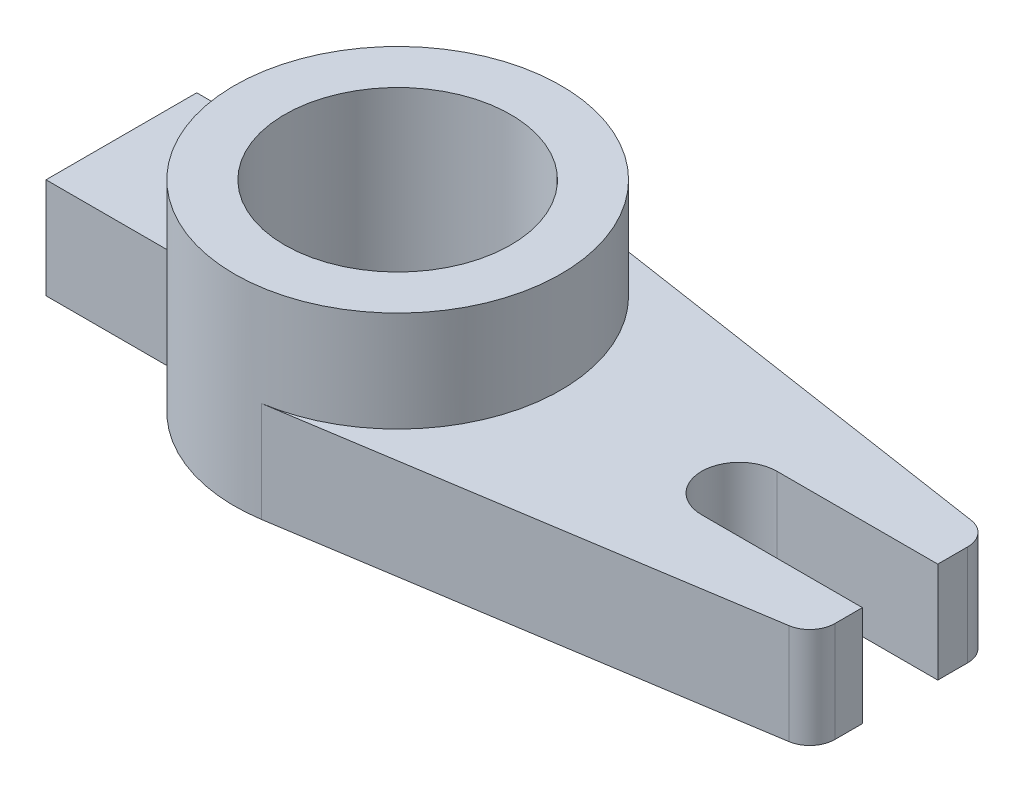
ISO-10303-21;
HEADER;
FILE_DESCRIPTION(('STEP AP214'),'2;1');
FILE_NAME('part.step','',(''),(''),'','','');
FILE_SCHEMA(('AUTOMOTIVE_DESIGN { 1 0 10303 214 1 1 1 1 }'));
ENDSEC;
DATA;
#1=APPLICATION_CONTEXT('core data for automotive mechanical design processes');
#2=APPLICATION_PROTOCOL_DEFINITION('international standard','automotive_design',2000,#1);
#3=PRODUCT_CONTEXT('',#1,'mechanical');
#4=PRODUCT('Part','Part','',(#3));
#5=PRODUCT_RELATED_PRODUCT_CATEGORY('part','',(#4));
#6=PRODUCT_DEFINITION_FORMATION('','',#4);
#7=PRODUCT_DEFINITION_CONTEXT('part definition',#1,'design');
#8=PRODUCT_DEFINITION('design','',#6,#7);
#9=PRODUCT_DEFINITION_SHAPE('','',#8);
#10=(LENGTH_UNIT() NAMED_UNIT(*) SI_UNIT(.MILLI.,.METRE.));
#11=(NAMED_UNIT(*) PLANE_ANGLE_UNIT() SI_UNIT($,.RADIAN.));
#12=(NAMED_UNIT(*) SI_UNIT($,.STERADIAN.) SOLID_ANGLE_UNIT());
#13=UNCERTAINTY_MEASURE_WITH_UNIT(LENGTH_MEASURE(1.E-05),#10,'distance_accuracy_value','');
#14=(GEOMETRIC_REPRESENTATION_CONTEXT(3) GLOBAL_UNCERTAINTY_ASSIGNED_CONTEXT((#13)) GLOBAL_UNIT_ASSIGNED_CONTEXT((#10,
#11,#12)) REPRESENTATION_CONTEXT('',''));
#15=CARTESIAN_POINT('',(0.,0.,0.));
#16=DIRECTION('',(0.,0.,1.));
#17=DIRECTION('',(1.,0.,0.));
#18=AXIS2_PLACEMENT_3D('',#15,#16,#17);
#19=CARTESIAN_POINT('',(0.,40.,0.));
#20=DIRECTION('',(0.,-1.,0.));
#21=DIRECTION('',(0.,0.,-1.));
#22=AXIS2_PLACEMENT_3D('',#19,#20,#21);
#23=CYLINDRICAL_SURFACE('',#22,32.5);
#24=CARTESIAN_POINT('',(0.,40.,0.));
#25=DIRECTION('',(0.,1.,0.));
#26=DIRECTION('',(0.,0.,1.));
#27=AXIS2_PLACEMENT_3D('',#24,#25,#26);
#28=CIRCLE('',#27,32.5);
#29=CARTESIAN_POINT('',(0.,40.,32.5));
#30=VERTEX_POINT('',#29);
#31=EDGE_CURVE('E197',#30,#30,#28,.T.);
#32=ORIENTED_EDGE('',*,*,#31,.F.);
#33=EDGE_LOOP('',(#32));
#34=FACE_BOUND('',#33,.T.);
#35=DIRECTION('',(0.,-1.,0.));
#36=VECTOR('',#35,1.);
#37=CARTESIAN_POINT('',(-28.831406486677,20.,-15.));
#38=LINE('',#37,#36);
#39=CARTESIAN_POINT('',(-28.831406486677,20.,-15.));
#40=VERTEX_POINT('',#39);
#41=CARTESIAN_POINT('',(-28.831406486677,0.,-15.));
#42=VERTEX_POINT('',#41);
#43=EDGE_CURVE('E64',#40,#42,#38,.T.);
#44=ORIENTED_EDGE('',*,*,#43,.F.);
#45=CARTESIAN_POINT('',(7.8756445809347E-13,20.,0.));
#46=DIRECTION('',(0.,-1.,0.));
#47=DIRECTION('',(0.,0.,1.));
#48=AXIS2_PLACEMENT_3D('',#45,#46,#47);
#49=CIRCLE('',#48,32.5000000000007);
#50=CARTESIAN_POINT('',(-28.831406486677,20.,15.));
#51=VERTEX_POINT('',#50);
#52=EDGE_CURVE('E59',#51,#40,#49,.T.);
#53=ORIENTED_EDGE('',*,*,#52,.F.);
#54=DIRECTION('',(0.,-1.,0.));
#55=VECTOR('',#54,1.);
#56=CARTESIAN_POINT('',(-28.831406486677,20.,15.));
#57=LINE('',#56,#55);
#58=CARTESIAN_POINT('',(-28.831406486677,0.,15.));
#59=VERTEX_POINT('',#58);
#60=EDGE_CURVE('E169',#51,#59,#57,.T.);
#61=ORIENTED_EDGE('',*,*,#60,.T.);
#62=CARTESIAN_POINT('',(0.,0.,0.));
#63=DIRECTION('',(0.,1.,0.));
#64=DIRECTION('',(0.,0.,1.));
#65=AXIS2_PLACEMENT_3D('',#62,#63,#64);
#66=CIRCLE('',#65,32.5);
#67=CARTESIAN_POINT('',(5.02174069701689,0.,32.1096888862524));
#68=VERTEX_POINT('',#67);
#69=EDGE_CURVE('E193',#59,#68,#66,.T.);
#70=ORIENTED_EDGE('',*,*,#69,.T.);
#71=DIRECTION('',(0.,-1.,0.));
#72=VECTOR('',#71,1.);
#73=CARTESIAN_POINT('',(5.02174069701689,20.,32.1096888862525));
#74=LINE('',#73,#72);
#75=CARTESIAN_POINT('',(5.02174069701689,20.,32.1096888862525));
#76=VERTEX_POINT('',#75);
#77=EDGE_CURVE('E11',#76,#68,#74,.T.);
#78=ORIENTED_EDGE('',*,*,#77,.F.);
#79=CARTESIAN_POINT('',(0.,20.,0.));
#80=DIRECTION('',(0.,-1.,0.));
#81=DIRECTION('',(0.,0.,-1.));
#82=AXIS2_PLACEMENT_3D('',#79,#80,#81);
#83=CIRCLE('',#82,32.5);
#84=CARTESIAN_POINT('',(4.86046625450318,20.,-32.1344965385929));
#85=VERTEX_POINT('',#84);
#86=EDGE_CURVE('E205',#85,#76,#83,.T.);
#87=ORIENTED_EDGE('',*,*,#86,.F.);
#88=DIRECTION('',(0.,-1.,0.));
#89=VECTOR('',#88,1.);
#90=CARTESIAN_POINT('',(4.86046625450318,20.,-32.1344965385929));
#91=LINE('',#90,#89);
#92=CARTESIAN_POINT('',(4.86046625450318,0.,-32.1344965385929));
#93=VERTEX_POINT('',#92);
#94=EDGE_CURVE('E237',#85,#93,#91,.T.);
#95=ORIENTED_EDGE('',*,*,#94,.T.);
#96=EDGE_CURVE('E202',#93,#42,#66,.T.);
#97=ORIENTED_EDGE('',*,*,#96,.T.);
#98=EDGE_LOOP('',(#44,#53,#61,#70,#78,#87,#95,#97));
#99=FACE_BOUND('',#98,.T.);
#100=ADVANCED_FACE('F43',(#34,#99),#23,.T.);
#101=CARTESIAN_POINT('',(95.7725754918488,20.,17.9168649697123));
#102=DIRECTION('',(-0.154515098369752,0.,-0.987990427269306));
#103=DIRECTION('',(-0.987990427269306,0.,0.154515098369752));
#104=AXIS2_PLACEMENT_3D('',#101,#102,#103);
#105=PLANE('',#104);
#106=DIRECTION('',(0.987990427269306,0.,-0.154515098369752));
#107=VECTOR('',#106,1.);
#108=CARTESIAN_POINT('',(95.7725754918488,0.,17.9168649697123));
#109=LINE('',#108,#107);
#110=CARTESIAN_POINT('',(95.7725754918488,0.,17.9168649697123));
#111=VERTEX_POINT('',#110);
#112=EDGE_CURVE('E201',#68,#111,#109,.T.);
#113=ORIENTED_EDGE('',*,*,#112,.T.);
#114=DIRECTION('',(0.,-1.,0.));
#115=VECTOR('',#114,1.);
#116=CARTESIAN_POINT('',(95.7725754918488,20.,17.9168649697123));
#117=LINE('',#116,#115);
#118=CARTESIAN_POINT('',(95.7725754918488,20.,17.9168649697123));
#119=VERTEX_POINT('',#118);
#120=EDGE_CURVE('E52',#119,#111,#117,.T.);
#121=ORIENTED_EDGE('',*,*,#120,.F.);
#122=DIRECTION('',(0.987990427269306,0.,-0.154515098369752));
#123=VECTOR('',#122,1.);
#124=CARTESIAN_POINT('',(95.7725754918488,20.,17.9168649697123));
#125=LINE('',#124,#123);
#126=EDGE_CURVE('E209',#76,#119,#125,.T.);
#127=ORIENTED_EDGE('',*,*,#126,.F.);
#128=ORIENTED_EDGE('',*,*,#77,.T.);
#129=EDGE_LOOP('',(#113,#121,#127,#128));
#130=FACE_BOUND('',#129,.T.);
#131=ADVANCED_FACE('F45',(#130),#105,.F.);
#132=CARTESIAN_POINT('',(95.,20.,12.9769128333658));
#133=DIRECTION('',(0.,-1.,0.));
#134=DIRECTION('',(0.,0.,-1.));
#135=AXIS2_PLACEMENT_3D('',#132,#133,#134);
#136=CYLINDRICAL_SURFACE('',#135,5.);
#137=CARTESIAN_POINT('',(95.,0.,12.9769128333658));
#138=DIRECTION('',(0.,1.,0.));
#139=DIRECTION('',(0.,0.,-1.));
#140=AXIS2_PLACEMENT_3D('',#137,#138,#139);
#141=CIRCLE('',#140,5.);
#142=CARTESIAN_POINT('',(100.,0.,12.9769128333658));
#143=VERTEX_POINT('',#142);
#144=EDGE_CURVE('E240',#111,#143,#141,.T.);
#145=ORIENTED_EDGE('',*,*,#144,.T.);
#146=DIRECTION('',(0.,-1.,0.));
#147=VECTOR('',#146,1.);
#148=CARTESIAN_POINT('',(100.,20.,12.9769128333658));
#149=LINE('',#148,#147);
#150=CARTESIAN_POINT('',(100.,20.,12.9769128333658));
#151=VERTEX_POINT('',#150);
#152=EDGE_CURVE('E290',#151,#143,#149,.T.);
#153=ORIENTED_EDGE('',*,*,#152,.F.);
#154=CARTESIAN_POINT('',(95.,20.,12.9769128333658));
#155=DIRECTION('',(0.,1.,0.));
#156=DIRECTION('',(0.,0.,-1.));
#157=AXIS2_PLACEMENT_3D('',#154,#155,#156);
#158=CIRCLE('',#157,5.);
#159=EDGE_CURVE('E213',#119,#151,#158,.T.);
#160=ORIENTED_EDGE('',*,*,#159,.F.);
#161=ORIENTED_EDGE('',*,*,#120,.T.);
#162=EDGE_LOOP('',(#145,#153,#160,#161));
#163=FACE_BOUND('',#162,.T.);
#164=ADVANCED_FACE('F299',(#163),#136,.T.);
#165=CARTESIAN_POINT('',(100.,20.,7.5));
#166=DIRECTION('',(-1.,0.,0.));
#167=DIRECTION('',(0.,0.,1.));
#168=AXIS2_PLACEMENT_3D('',#165,#166,#167);
#169=PLANE('',#168);
#170=DIRECTION('',(0.,0.,-1.));
#171=VECTOR('',#170,1.);
#172=CARTESIAN_POINT('',(100.,0.,7.5));
#173=LINE('',#172,#171);
#174=CARTESIAN_POINT('',(100.,0.,7.5));
#175=VERTEX_POINT('',#174);
#176=EDGE_CURVE('E243',#143,#175,#173,.T.);
#177=ORIENTED_EDGE('',*,*,#176,.T.);
#178=DIRECTION('',(0.,-1.,0.));
#179=VECTOR('',#178,1.);
#180=CARTESIAN_POINT('',(100.,20.,7.5));
#181=LINE('',#180,#179);
#182=CARTESIAN_POINT('',(100.,20.,7.5));
#183=VERTEX_POINT('',#182);
#184=EDGE_CURVE('E286',#183,#175,#181,.T.);
#185=ORIENTED_EDGE('',*,*,#184,.F.);
#186=DIRECTION('',(0.,0.,-1.));
#187=VECTOR('',#186,1.);
#188=CARTESIAN_POINT('',(100.,20.,7.5));
#189=LINE('',#188,#187);
#190=EDGE_CURVE('E216',#151,#183,#189,.T.);
#191=ORIENTED_EDGE('',*,*,#190,.F.);
#192=ORIENTED_EDGE('',*,*,#152,.T.);
#193=EDGE_LOOP('',(#177,#185,#191,#192));
#194=FACE_BOUND('',#193,.T.);
#195=ADVANCED_FACE('F311',(#194),#169,.F.);
#196=CARTESIAN_POINT('',(68.,20.,7.5));
#197=DIRECTION('',(0.,0.,1.));
#198=DIRECTION('',(1.,0.,0.));
#199=AXIS2_PLACEMENT_3D('',#196,#197,#198);
#200=PLANE('',#199);
#201=DIRECTION('',(-1.,0.,0.));
#202=VECTOR('',#201,1.);
#203=CARTESIAN_POINT('',(68.,0.,7.5));
#204=LINE('',#203,#202);
#205=CARTESIAN_POINT('',(68.,0.,7.5));
#206=VERTEX_POINT('',#205);
#207=EDGE_CURVE('E246',#175,#206,#204,.T.);
#208=ORIENTED_EDGE('',*,*,#207,.T.);
#209=DIRECTION('',(0.,-1.,0.));
#210=VECTOR('',#209,1.);
#211=CARTESIAN_POINT('',(68.,20.,7.5));
#212=LINE('',#211,#210);
#213=CARTESIAN_POINT('',(68.,20.,7.5));
#214=VERTEX_POINT('',#213);
#215=EDGE_CURVE('E282',#214,#206,#212,.T.);
#216=ORIENTED_EDGE('',*,*,#215,.F.);
#217=DIRECTION('',(-1.,0.,0.));
#218=VECTOR('',#217,1.);
#219=CARTESIAN_POINT('',(68.,20.,7.5));
#220=LINE('',#219,#218);
#221=EDGE_CURVE('E219',#183,#214,#220,.T.);
#222=ORIENTED_EDGE('',*,*,#221,.F.);
#223=ORIENTED_EDGE('',*,*,#184,.T.);
#224=EDGE_LOOP('',(#208,#216,#222,#223));
#225=FACE_BOUND('',#224,.T.);
#226=ADVANCED_FACE('F315',(#225),#200,.F.);
#227=CARTESIAN_POINT('',(68.,20.,0.));
#228=DIRECTION('',(0.,-1.,0.));
#229=DIRECTION('',(0.,0.,-1.));
#230=AXIS2_PLACEMENT_3D('',#227,#228,#229);
#231=CYLINDRICAL_SURFACE('',#230,7.5);
#232=CARTESIAN_POINT('',(68.,0.,0.));
#233=DIRECTION('',(0.,-1.,0.));
#234=DIRECTION('',(0.,0.,1.));
#235=AXIS2_PLACEMENT_3D('',#232,#233,#234);
#236=CIRCLE('',#235,7.5);
#237=CARTESIAN_POINT('',(68.,0.,-7.5));
#238=VERTEX_POINT('',#237);
#239=EDGE_CURVE('E249',#206,#238,#236,.T.);
#240=ORIENTED_EDGE('',*,*,#239,.T.);
#241=DIRECTION('',(0.,-1.,0.));
#242=VECTOR('',#241,1.);
#243=CARTESIAN_POINT('',(68.,20.,-7.5));
#244=LINE('',#243,#242);
#245=CARTESIAN_POINT('',(68.,20.,-7.5));
#246=VERTEX_POINT('',#245);
#247=EDGE_CURVE('E278',#246,#238,#244,.T.);
#248=ORIENTED_EDGE('',*,*,#247,.F.);
#249=CARTESIAN_POINT('',(68.,20.,0.));
#250=DIRECTION('',(0.,-1.,0.));
#251=DIRECTION('',(0.,0.,1.));
#252=AXIS2_PLACEMENT_3D('',#249,#250,#251);
#253=CIRCLE('',#252,7.5);
#254=EDGE_CURVE('E222',#214,#246,#253,.T.);
#255=ORIENTED_EDGE('',*,*,#254,.F.);
#256=ORIENTED_EDGE('',*,*,#215,.T.);
#257=EDGE_LOOP('',(#240,#248,#255,#256));
#258=FACE_BOUND('',#257,.T.);
#259=ADVANCED_FACE('F366',(#258),#231,.F.);
#260=CARTESIAN_POINT('',(68.,20.,-7.5));
#261=DIRECTION('',(0.,0.,-1.));
#262=DIRECTION('',(-1.,0.,0.));
#263=AXIS2_PLACEMENT_3D('',#260,#261,#262);
#264=PLANE('',#263);
#265=DIRECTION('',(1.,0.,0.));
#266=VECTOR('',#265,1.);
#267=CARTESIAN_POINT('',(68.,0.,-7.5));
#268=LINE('',#267,#266);
#269=CARTESIAN_POINT('',(100.,0.,-7.5));
#270=VERTEX_POINT('',#269);
#271=EDGE_CURVE('E252',#238,#270,#268,.T.);
#272=ORIENTED_EDGE('',*,*,#271,.T.);
#273=DIRECTION('',(0.,-1.,0.));
#274=VECTOR('',#273,1.);
#275=CARTESIAN_POINT('',(100.,20.,-7.5));
#276=LINE('',#275,#274);
#277=CARTESIAN_POINT('',(100.,20.,-7.5));
#278=VERTEX_POINT('',#277);
#279=EDGE_CURVE('E274',#278,#270,#276,.T.);
#280=ORIENTED_EDGE('',*,*,#279,.F.);
#281=DIRECTION('',(1.,0.,0.));
#282=VECTOR('',#281,1.);
#283=CARTESIAN_POINT('',(68.,20.,-7.5));
#284=LINE('',#283,#282);
#285=EDGE_CURVE('E225',#246,#278,#284,.T.);
#286=ORIENTED_EDGE('',*,*,#285,.F.);
#287=ORIENTED_EDGE('',*,*,#247,.T.);
#288=EDGE_LOOP('',(#272,#280,#286,#287));
#289=FACE_BOUND('',#288,.T.);
#290=ADVANCED_FACE('F362',(#289),#264,.F.);
#291=CARTESIAN_POINT('',(100.,20.,-13.4436743175163));
#292=DIRECTION('',(-1.,0.,0.));
#293=DIRECTION('',(0.,0.,1.));
#294=AXIS2_PLACEMENT_3D('',#291,#292,#293);
#295=PLANE('',#294);
#296=DIRECTION('',(0.,0.,-1.));
#297=VECTOR('',#296,1.);
#298=CARTESIAN_POINT('',(100.,0.,-13.4436743175163));
#299=LINE('',#298,#297);
#300=CARTESIAN_POINT('',(100.,0.,-13.4436743175163));
#301=VERTEX_POINT('',#300);
#302=EDGE_CURVE('E255',#270,#301,#299,.T.);
#303=ORIENTED_EDGE('',*,*,#302,.T.);
#304=DIRECTION('',(0.,-1.,0.));
#305=VECTOR('',#304,1.);
#306=CARTESIAN_POINT('',(100.,20.,-13.4436743175163));
#307=LINE('',#306,#305);
#308=CARTESIAN_POINT('',(100.,20.,-13.4436743175163));
#309=VERTEX_POINT('',#308);
#310=EDGE_CURVE('E270',#309,#301,#307,.T.);
#311=ORIENTED_EDGE('',*,*,#310,.F.);
#312=DIRECTION('',(0.,0.,-1.));
#313=VECTOR('',#312,1.);
#314=CARTESIAN_POINT('',(100.,20.,-13.4436743175163));
#315=LINE('',#314,#313);
#316=EDGE_CURVE('E228',#278,#309,#315,.T.);
#317=ORIENTED_EDGE('',*,*,#316,.F.);
#318=ORIENTED_EDGE('',*,*,#279,.T.);
#319=EDGE_LOOP('',(#303,#311,#317,#318));
#320=FACE_BOUND('',#319,.T.);
#321=ADVANCED_FACE('F358',(#320),#295,.F.);
#322=CARTESIAN_POINT('',(95.,20.,-13.4436743175163));
#323=DIRECTION('',(0.,-1.,0.));
#324=DIRECTION('',(0.,0.,-1.));
#325=AXIS2_PLACEMENT_3D('',#322,#323,#324);
#326=CYLINDRICAL_SURFACE('',#325,5.00000000000001);
#327=CARTESIAN_POINT('',(95.,0.,-13.4436743175163));
#328=DIRECTION('',(0.,1.,0.));
#329=DIRECTION('',(0.,0.,1.));
#330=AXIS2_PLACEMENT_3D('',#327,#328,#329);
#331=CIRCLE('',#330,5.00000000000001);
#332=CARTESIAN_POINT('',(95.7477640391543,0.,-18.3874430157613));
#333=VERTEX_POINT('',#332);
#334=EDGE_CURVE('E258',#301,#333,#331,.T.);
#335=ORIENTED_EDGE('',*,*,#334,.T.);
#336=DIRECTION('',(0.,-1.,0.));
#337=VECTOR('',#336,1.);
#338=CARTESIAN_POINT('',(95.7477640391543,20.,-18.3874430157613));
#339=LINE('',#338,#337);
#340=CARTESIAN_POINT('',(95.7477640391543,20.,-18.3874430157613));
#341=VERTEX_POINT('',#340);
#342=EDGE_CURVE('E266',#341,#333,#339,.T.);
#343=ORIENTED_EDGE('',*,*,#342,.F.);
#344=CARTESIAN_POINT('',(95.,20.,-13.4436743175163));
#345=DIRECTION('',(0.,1.,0.));
#346=DIRECTION('',(0.,0.,1.));
#347=AXIS2_PLACEMENT_3D('',#344,#345,#346);
#348=CIRCLE('',#347,5.00000000000001);
#349=EDGE_CURVE('E231',#309,#341,#348,.T.);
#350=ORIENTED_EDGE('',*,*,#349,.F.);
#351=ORIENTED_EDGE('',*,*,#310,.T.);
#352=EDGE_LOOP('',(#335,#343,#350,#351));
#353=FACE_BOUND('',#352,.T.);
#354=ADVANCED_FACE('F354',(#353),#326,.T.);
#355=CARTESIAN_POINT('',(4.86046625450318,20.,-32.1344965385929));
#356=DIRECTION('',(-0.149552807830868,0.,0.988753739649011));
#357=DIRECTION('',(0.988753739649011,0.,0.149552807830868));
#358=AXIS2_PLACEMENT_3D('',#355,#356,#357);
#359=PLANE('',#358);
#360=DIRECTION('',(-0.988753739649011,0.,-0.149552807830868));
#361=VECTOR('',#360,1.);
#362=CARTESIAN_POINT('',(4.86046625450318,0.,-32.1344965385929));
#363=LINE('',#362,#361);
#364=EDGE_CURVE('E210',#333,#93,#363,.T.);
#365=ORIENTED_EDGE('',*,*,#364,.T.);
#366=ORIENTED_EDGE('',*,*,#94,.F.);
#367=DIRECTION('',(-0.988753739649011,0.,-0.149552807830868));
#368=VECTOR('',#367,1.);
#369=CARTESIAN_POINT('',(4.86046625450318,20.,-32.1344965385929));
#370=LINE('',#369,#368);
#371=EDGE_CURVE('E234',#341,#85,#370,.T.);
#372=ORIENTED_EDGE('',*,*,#371,.F.);
#373=ORIENTED_EDGE('',*,*,#342,.T.);
#374=EDGE_LOOP('',(#365,#366,#372,#373));
#375=FACE_BOUND('',#374,.T.);
#376=ADVANCED_FACE('F349',(#375),#359,.F.);
#377=CARTESIAN_POINT('',(0.,20.,0.));
#378=DIRECTION('',(0.,-1.,0.));
#379=DIRECTION('',(0.,0.,-1.));
#380=AXIS2_PLACEMENT_3D('',#377,#378,#379);
#381=PLANE('',#380);
#382=ORIENTED_EDGE('',*,*,#86,.T.);
#383=ORIENTED_EDGE('',*,*,#126,.T.);
#384=ORIENTED_EDGE('',*,*,#159,.T.);
#385=ORIENTED_EDGE('',*,*,#190,.T.);
#386=ORIENTED_EDGE('',*,*,#221,.T.);
#387=ORIENTED_EDGE('',*,*,#254,.T.);
#388=ORIENTED_EDGE('',*,*,#285,.T.);
#389=ORIENTED_EDGE('',*,*,#316,.T.);
#390=ORIENTED_EDGE('',*,*,#349,.T.);
#391=ORIENTED_EDGE('',*,*,#371,.T.);
#392=EDGE_LOOP('',(#382,#383,#384,#385,#386,#387,#388,#389,#390,#391));
#393=FACE_BOUND('',#392,.T.);
#394=ADVANCED_FACE('F319',(#393),#381,.F.);
#395=CARTESIAN_POINT('',(0.,0.,0.));
#396=DIRECTION('',(0.,-1.,0.));
#397=DIRECTION('',(0.,0.,-1.));
#398=AXIS2_PLACEMENT_3D('',#395,#396,#397);
#399=PLANE('',#398);
#400=ORIENTED_EDGE('',*,*,#112,.F.);
#401=ORIENTED_EDGE('',*,*,#69,.F.);
#402=DIRECTION('',(1.,0.,0.));
#403=VECTOR('',#402,1.);
#404=CARTESIAN_POINT('',(-55.,0.,15.));
#405=LINE('',#404,#403);
#406=CARTESIAN_POINT('',(-55.,0.,15.));
#407=VERTEX_POINT('',#406);
#408=EDGE_CURVE('E178',#407,#59,#405,.T.);
#409=ORIENTED_EDGE('',*,*,#408,.F.);
#410=DIRECTION('',(0.,0.,1.));
#411=VECTOR('',#410,1.);
#412=CARTESIAN_POINT('',(-55.,0.,-15.));
#413=LINE('',#412,#411);
#414=CARTESIAN_POINT('',(-55.,0.,-15.));
#415=VERTEX_POINT('',#414);
#416=EDGE_CURVE('E175',#415,#407,#413,.T.);
#417=ORIENTED_EDGE('',*,*,#416,.F.);
#418=DIRECTION('',(-1.,0.,0.));
#419=VECTOR('',#418,1.);
#420=CARTESIAN_POINT('',(-28.831406486677,0.,-15.));
#421=LINE('',#420,#419);
#422=EDGE_CURVE('E156',#42,#415,#421,.T.);
#423=ORIENTED_EDGE('',*,*,#422,.F.);
#424=ORIENTED_EDGE('',*,*,#96,.F.);
#425=ORIENTED_EDGE('',*,*,#364,.F.);
#426=ORIENTED_EDGE('',*,*,#334,.F.);
#427=ORIENTED_EDGE('',*,*,#302,.F.);
#428=ORIENTED_EDGE('',*,*,#271,.F.);
#429=ORIENTED_EDGE('',*,*,#239,.F.);
#430=ORIENTED_EDGE('',*,*,#207,.F.);
#431=ORIENTED_EDGE('',*,*,#176,.F.);
#432=ORIENTED_EDGE('',*,*,#144,.F.);
#433=EDGE_LOOP('',(#400,#401,#409,#417,#423,#424,#425,#426,#427,#428,#429,#430,#431,#432));
#434=FACE_BOUND('',#433,.T.);
#435=CARTESIAN_POINT('',(0.,0.,0.));
#436=DIRECTION('',(0.,1.,0.));
#437=DIRECTION('',(0.,0.,1.));
#438=AXIS2_PLACEMENT_3D('',#435,#436,#437);
#439=CIRCLE('',#438,22.5);
#440=CARTESIAN_POINT('',(0.,0.,22.5));
#441=VERTEX_POINT('',#440);
#442=EDGE_CURVE('E188',#441,#441,#439,.T.);
#443=ORIENTED_EDGE('',*,*,#442,.T.);
#444=EDGE_LOOP('',(#443));
#445=FACE_BOUND('',#444,.T.);
#446=ADVANCED_FACE('F305',(#434,#445),#399,.T.);
#447=CARTESIAN_POINT('',(0.,40.,0.));
#448=DIRECTION('',(0.,1.,0.));
#449=DIRECTION('',(0.,0.,1.));
#450=AXIS2_PLACEMENT_3D('',#447,#448,#449);
#451=PLANE('',#450);
#452=ORIENTED_EDGE('',*,*,#31,.T.);
#453=EDGE_LOOP('',(#452));
#454=FACE_BOUND('',#453,.T.);
#455=CARTESIAN_POINT('',(0.,40.,0.));
#456=DIRECTION('',(0.,1.,0.));
#457=DIRECTION('',(0.,0.,1.));
#458=AXIS2_PLACEMENT_3D('',#455,#456,#457);
#459=CIRCLE('',#458,22.5);
#460=CARTESIAN_POINT('',(0.,40.,22.5));
#461=VERTEX_POINT('',#460);
#462=EDGE_CURVE('E189',#461,#461,#459,.T.);
#463=ORIENTED_EDGE('',*,*,#462,.F.);
#464=EDGE_LOOP('',(#463));
#465=FACE_BOUND('',#464,.T.);
#466=ADVANCED_FACE('F345',(#454,#465),#451,.T.);
#467=CARTESIAN_POINT('',(0.,40.,0.));
#468=DIRECTION('',(0.,-1.,0.));
#469=DIRECTION('',(0.,0.,-1.));
#470=AXIS2_PLACEMENT_3D('',#467,#468,#469);
#471=CYLINDRICAL_SURFACE('',#470,22.5);
#472=ORIENTED_EDGE('',*,*,#462,.T.);
#473=EDGE_LOOP('',(#472));
#474=FACE_BOUND('',#473,.T.);
#475=ORIENTED_EDGE('',*,*,#442,.F.);
#476=EDGE_LOOP('',(#475));
#477=FACE_BOUND('',#476,.T.);
#478=ADVANCED_FACE('F422',(#474,#477),#471,.F.);
#479=CARTESIAN_POINT('',(-28.831406486677,20.,-15.));
#480=DIRECTION('',(0.,0.,1.));
#481=DIRECTION('',(1.,0.,0.));
#482=AXIS2_PLACEMENT_3D('',#479,#480,#481);
#483=PLANE('',#482);
#484=ORIENTED_EDGE('',*,*,#422,.T.);
#485=DIRECTION('',(0.,-1.,0.));
#486=VECTOR('',#485,1.);
#487=CARTESIAN_POINT('',(-55.,20.,-15.));
#488=LINE('',#487,#486);
#489=CARTESIAN_POINT('',(-55.,20.,-15.));
#490=VERTEX_POINT('',#489);
#491=EDGE_CURVE('E153',#490,#415,#488,.T.);
#492=ORIENTED_EDGE('',*,*,#491,.F.);
#493=DIRECTION('',(-1.,0.,0.));
#494=VECTOR('',#493,1.);
#495=CARTESIAN_POINT('',(-28.831406486677,20.,-15.));
#496=LINE('',#495,#494);
#497=EDGE_CURVE('E143',#40,#490,#496,.T.);
#498=ORIENTED_EDGE('',*,*,#497,.F.);
#499=ORIENTED_EDGE('',*,*,#43,.T.);
#500=EDGE_LOOP('',(#484,#492,#498,#499));
#501=FACE_BOUND('',#500,.T.);
#502=ADVANCED_FACE('F154',(#501),#483,.F.);
#503=CARTESIAN_POINT('',(-55.,20.,-15.));
#504=DIRECTION('',(1.,0.,0.));
#505=DIRECTION('',(0.,0.,-1.));
#506=AXIS2_PLACEMENT_3D('',#503,#504,#505);
#507=PLANE('',#506);
#508=ORIENTED_EDGE('',*,*,#416,.T.);
#509=DIRECTION('',(0.,-1.,0.));
#510=VECTOR('',#509,1.);
#511=CARTESIAN_POINT('',(-55.,20.,15.));
#512=LINE('',#511,#510);
#513=CARTESIAN_POINT('',(-55.,20.,15.));
#514=VERTEX_POINT('',#513);
#515=EDGE_CURVE('E160',#514,#407,#512,.T.);
#516=ORIENTED_EDGE('',*,*,#515,.F.);
#517=DIRECTION('',(0.,0.,1.));
#518=VECTOR('',#517,1.);
#519=CARTESIAN_POINT('',(-55.,20.,-15.));
#520=LINE('',#519,#518);
#521=EDGE_CURVE('E147',#490,#514,#520,.T.);
#522=ORIENTED_EDGE('',*,*,#521,.F.);
#523=ORIENTED_EDGE('',*,*,#491,.T.);
#524=EDGE_LOOP('',(#508,#516,#522,#523));
#525=FACE_BOUND('',#524,.T.);
#526=ADVANCED_FACE('F162',(#525),#507,.F.);
#527=CARTESIAN_POINT('',(-55.,20.,15.));
#528=DIRECTION('',(0.,0.,-1.));
#529=DIRECTION('',(-1.,0.,0.));
#530=AXIS2_PLACEMENT_3D('',#527,#528,#529);
#531=PLANE('',#530);
#532=ORIENTED_EDGE('',*,*,#408,.T.);
#533=ORIENTED_EDGE('',*,*,#60,.F.);
#534=DIRECTION('',(1.,0.,0.));
#535=VECTOR('',#534,1.);
#536=CARTESIAN_POINT('',(-55.,20.,15.));
#537=LINE('',#536,#535);
#538=EDGE_CURVE('E166',#514,#51,#537,.T.);
#539=ORIENTED_EDGE('',*,*,#538,.F.);
#540=ORIENTED_EDGE('',*,*,#515,.T.);
#541=EDGE_LOOP('',(#532,#533,#539,#540));
#542=FACE_BOUND('',#541,.T.);
#543=ADVANCED_FACE('F327',(#542),#531,.F.);
#544=CARTESIAN_POINT('',(7.8756445809347E-13,20.,0.));
#545=DIRECTION('',(0.,1.,0.));
#546=DIRECTION('',(0.,0.,1.));
#547=AXIS2_PLACEMENT_3D('',#544,#545,#546);
#548=PLANE('',#547);
#549=ORIENTED_EDGE('',*,*,#52,.T.);
#550=ORIENTED_EDGE('',*,*,#497,.T.);
#551=ORIENTED_EDGE('',*,*,#521,.T.);
#552=ORIENTED_EDGE('',*,*,#538,.T.);
#553=EDGE_LOOP('',(#549,#550,#551,#552));
#554=FACE_BOUND('',#553,.T.);
#555=ADVANCED_FACE('F145',(#554),#548,.T.);
#556=CLOSED_SHELL('',(#100,#131,#164,#195,#226,#259,#290,#321,#354,#376,#394,#446,#466,#478,
#502,#526,#543,#555));
#557=MANIFOLD_SOLID_BREP('B2',#556);
#558=ADVANCED_BREP_SHAPE_REPRESENTATION('',(#18,#557),#14);
#559=SHAPE_DEFINITION_REPRESENTATION(#9,#558);
ENDSEC;
END-ISO-10303-21;
